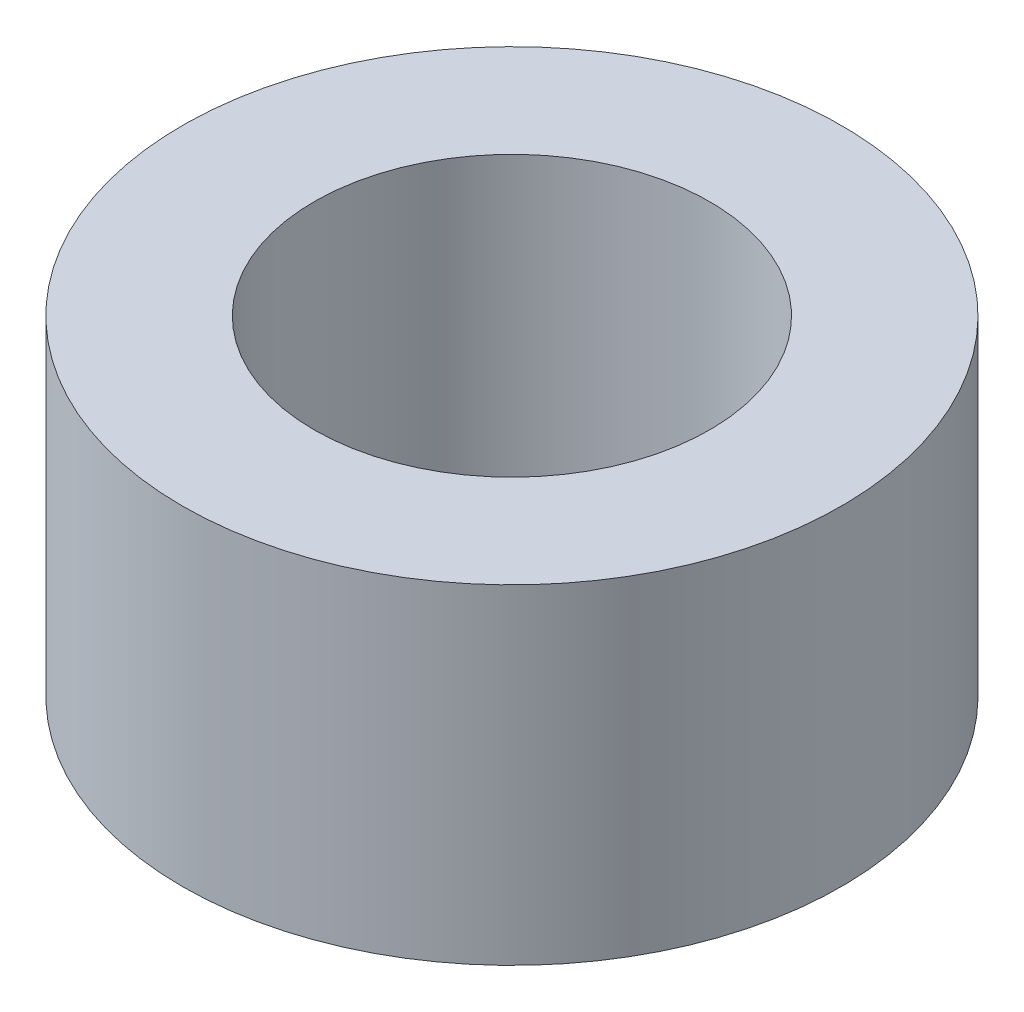
ISO-10303-21;
HEADER;
FILE_DESCRIPTION(('STEP AP214'),'2;1');
FILE_NAME('part.step','',(''),(''),'','','');
FILE_SCHEMA(('AUTOMOTIVE_DESIGN { 1 0 10303 214 1 1 1 1 }'));
ENDSEC;
DATA;
#1=APPLICATION_CONTEXT('core data for automotive mechanical design processes');
#2=APPLICATION_PROTOCOL_DEFINITION('international standard','automotive_design',2000,#1);
#3=PRODUCT_CONTEXT('',#1,'mechanical');
#4=PRODUCT('Part','Part','',(#3));
#5=PRODUCT_RELATED_PRODUCT_CATEGORY('part','',(#4));
#6=PRODUCT_DEFINITION_FORMATION('','',#4);
#7=PRODUCT_DEFINITION_CONTEXT('part definition',#1,'design');
#8=PRODUCT_DEFINITION('design','',#6,#7);
#9=PRODUCT_DEFINITION_SHAPE('','',#8);
#10=(LENGTH_UNIT() NAMED_UNIT(*) SI_UNIT(.MILLI.,.METRE.));
#11=(NAMED_UNIT(*) PLANE_ANGLE_UNIT() SI_UNIT($,.RADIAN.));
#12=(NAMED_UNIT(*) SI_UNIT($,.STERADIAN.) SOLID_ANGLE_UNIT());
#13=UNCERTAINTY_MEASURE_WITH_UNIT(LENGTH_MEASURE(1.E-05),#10,'distance_accuracy_value','');
#14=(GEOMETRIC_REPRESENTATION_CONTEXT(3) GLOBAL_UNCERTAINTY_ASSIGNED_CONTEXT((#13)) GLOBAL_UNIT_ASSIGNED_CONTEXT((#10,
#11,#12)) REPRESENTATION_CONTEXT('',''));
#15=CARTESIAN_POINT('',(0.,0.,0.));
#16=DIRECTION('',(0.,0.,1.));
#17=DIRECTION('',(1.,0.,0.));
#18=AXIS2_PLACEMENT_3D('',#15,#16,#17);
#19=CARTESIAN_POINT('',(0.,5.,0.));
#20=DIRECTION('',(0.,1.,0.));
#21=DIRECTION('',(0.,0.,1.));
#22=AXIS2_PLACEMENT_3D('',#19,#20,#21);
#23=PLANE('',#22);
#24=CARTESIAN_POINT('',(0.,5.,0.));
#25=DIRECTION('',(0.,1.,0.));
#26=DIRECTION('',(0.,0.,1.));
#27=AXIS2_PLACEMENT_3D('',#24,#25,#26);
#28=CIRCLE('',#27,5.);
#29=CARTESIAN_POINT('',(0.,5.,5.));
#30=VERTEX_POINT('',#29);
#31=EDGE_CURVE('E10',#30,#30,#28,.T.);
#32=ORIENTED_EDGE('',*,*,#31,.T.);
#33=EDGE_LOOP('',(#32));
#34=FACE_BOUND('',#33,.T.);
#35=CARTESIAN_POINT('',(0.,5.,0.));
#36=DIRECTION('',(0.,1.,0.));
#37=DIRECTION('',(0.,0.,1.));
#38=AXIS2_PLACEMENT_3D('',#35,#36,#37);
#39=CIRCLE('',#38,3.);
#40=CARTESIAN_POINT('',(0.,5.,3.));
#41=VERTEX_POINT('',#40);
#42=EDGE_CURVE('E44',#41,#41,#39,.T.);
#43=ORIENTED_EDGE('',*,*,#42,.F.);
#44=EDGE_LOOP('',(#43));
#45=FACE_BOUND('',#44,.T.);
#46=ADVANCED_FACE('F33',(#34,#45),#23,.T.);
#47=CARTESIAN_POINT('',(0.,0.,0.));
#48=DIRECTION('',(0.,1.,0.));
#49=DIRECTION('',(0.,0.,1.));
#50=AXIS2_PLACEMENT_3D('',#47,#48,#49);
#51=PLANE('',#50);
#52=CARTESIAN_POINT('',(0.,0.,0.));
#53=DIRECTION('',(0.,1.,0.));
#54=DIRECTION('',(0.,0.,1.));
#55=AXIS2_PLACEMENT_3D('',#52,#53,#54);
#56=CIRCLE('',#55,5.);
#57=CARTESIAN_POINT('',(0.,0.,5.));
#58=VERTEX_POINT('',#57);
#59=EDGE_CURVE('E37',#58,#58,#56,.T.);
#60=ORIENTED_EDGE('',*,*,#59,.F.);
#61=EDGE_LOOP('',(#60));
#62=FACE_BOUND('',#61,.T.);
#63=CARTESIAN_POINT('',(0.,0.,0.));
#64=DIRECTION('',(0.,1.,0.));
#65=DIRECTION('',(0.,0.,1.));
#66=AXIS2_PLACEMENT_3D('',#63,#64,#65);
#67=CIRCLE('',#66,3.);
#68=CARTESIAN_POINT('',(0.,0.,3.));
#69=VERTEX_POINT('',#68);
#70=EDGE_CURVE('E46',#69,#69,#67,.T.);
#71=ORIENTED_EDGE('',*,*,#70,.T.);
#72=EDGE_LOOP('',(#71));
#73=FACE_BOUND('',#72,.T.);
#74=ADVANCED_FACE('F56',(#62,#73),#51,.F.);
#75=CARTESIAN_POINT('',(0.,5.,0.));
#76=DIRECTION('',(0.,-1.,0.));
#77=DIRECTION('',(0.,0.,-1.));
#78=AXIS2_PLACEMENT_3D('',#75,#76,#77);
#79=CYLINDRICAL_SURFACE('',#78,5.);
#80=ORIENTED_EDGE('',*,*,#31,.F.);
#81=EDGE_LOOP('',(#80));
#82=FACE_BOUND('',#81,.T.);
#83=ORIENTED_EDGE('',*,*,#59,.T.);
#84=EDGE_LOOP('',(#83));
#85=FACE_BOUND('',#84,.T.);
#86=ADVANCED_FACE('F35',(#82,#85),#79,.T.);
#87=CARTESIAN_POINT('',(0.,5.,0.));
#88=DIRECTION('',(0.,-1.,0.));
#89=DIRECTION('',(0.,0.,-1.));
#90=AXIS2_PLACEMENT_3D('',#87,#88,#89);
#91=CYLINDRICAL_SURFACE('',#90,3.);
#92=ORIENTED_EDGE('',*,*,#42,.T.);
#93=EDGE_LOOP('',(#92));
#94=FACE_BOUND('',#93,.T.);
#95=ORIENTED_EDGE('',*,*,#70,.F.);
#96=EDGE_LOOP('',(#95));
#97=FACE_BOUND('',#96,.T.);
#98=ADVANCED_FACE('F52',(#94,#97),#91,.F.);
#99=CLOSED_SHELL('',(#46,#74,#86,#98));
#100=MANIFOLD_SOLID_BREP('B2',#99);
#101=ADVANCED_BREP_SHAPE_REPRESENTATION('',(#18,#100),#14);
#102=SHAPE_DEFINITION_REPRESENTATION(#9,#101);
ENDSEC;
END-ISO-10303-21;
